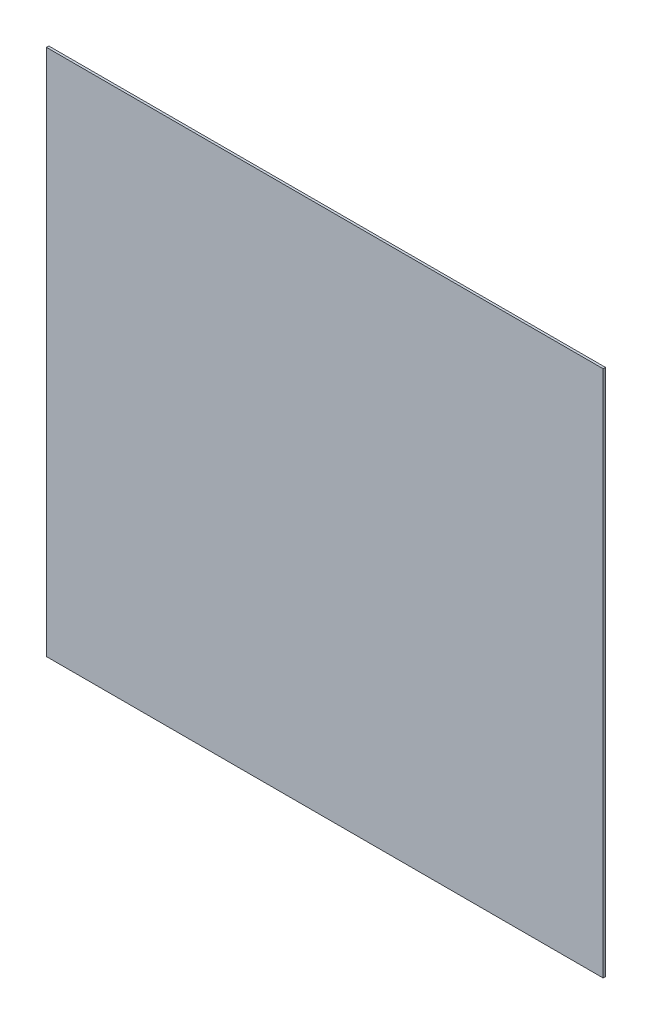
ISO-10303-21;
HEADER;
FILE_DESCRIPTION(('STEP AP214'),'2;1');
FILE_NAME('part.step','',(''),(''),'','','');
FILE_SCHEMA(('AUTOMOTIVE_DESIGN { 1 0 10303 214 1 1 1 1 }'));
ENDSEC;
DATA;
#1=APPLICATION_CONTEXT('core data for automotive mechanical design processes');
#2=APPLICATION_PROTOCOL_DEFINITION('international standard','automotive_design',2000,#1);
#3=PRODUCT_CONTEXT('',#1,'mechanical');
#4=PRODUCT('Part','Part','',(#3));
#5=PRODUCT_RELATED_PRODUCT_CATEGORY('part','',(#4));
#6=PRODUCT_DEFINITION_FORMATION('','',#4);
#7=PRODUCT_DEFINITION_CONTEXT('part definition',#1,'design');
#8=PRODUCT_DEFINITION('design','',#6,#7);
#9=PRODUCT_DEFINITION_SHAPE('','',#8);
#10=(LENGTH_UNIT() NAMED_UNIT(*) SI_UNIT(.MILLI.,.METRE.));
#11=(NAMED_UNIT(*) PLANE_ANGLE_UNIT() SI_UNIT($,.RADIAN.));
#12=(NAMED_UNIT(*) SI_UNIT($,.STERADIAN.) SOLID_ANGLE_UNIT());
#13=UNCERTAINTY_MEASURE_WITH_UNIT(LENGTH_MEASURE(1.E-05),#10,'distance_accuracy_value','');
#14=(GEOMETRIC_REPRESENTATION_CONTEXT(3) GLOBAL_UNCERTAINTY_ASSIGNED_CONTEXT((#13)) GLOBAL_UNIT_ASSIGNED_CONTEXT((#10,
#11,#12)) REPRESENTATION_CONTEXT('',''));
#15=CARTESIAN_POINT('',(0.,0.,0.));
#16=DIRECTION('',(0.,0.,1.));
#17=DIRECTION('',(1.,0.,0.));
#18=AXIS2_PLACEMENT_3D('',#15,#16,#17);
#19=CARTESIAN_POINT('',(560.475,-531.2625,4.7625));
#20=DIRECTION('',(-1.,0.,0.));
#21=DIRECTION('',(0.,0.,1.));
#22=AXIS2_PLACEMENT_3D('',#19,#20,#21);
#23=PLANE('',#22);
#24=DIRECTION('',(0.,1.,0.));
#25=VECTOR('',#24,1.);
#26=CARTESIAN_POINT('',(560.475,-531.2625,0.));
#27=LINE('',#26,#25);
#28=CARTESIAN_POINT('',(560.475,-531.2625,0.));
#29=VERTEX_POINT('',#28);
#30=CARTESIAN_POINT('',(560.475,531.2625,0.));
#31=VERTEX_POINT('',#30);
#32=EDGE_CURVE('E100',#29,#31,#27,.T.);
#33=ORIENTED_EDGE('',*,*,#32,.T.);
#34=DIRECTION('',(0.,0.,-1.));
#35=VECTOR('',#34,1.);
#36=CARTESIAN_POINT('',(560.475,531.2625,4.7625));
#37=LINE('',#36,#35);
#38=CARTESIAN_POINT('',(560.475,531.2625,4.7625));
#39=VERTEX_POINT('',#38);
#40=EDGE_CURVE('E11',#39,#31,#37,.T.);
#41=ORIENTED_EDGE('',*,*,#40,.F.);
#42=DIRECTION('',(0.,1.,0.));
#43=VECTOR('',#42,1.);
#44=CARTESIAN_POINT('',(560.475,-531.2625,4.7625));
#45=LINE('',#44,#43);
#46=CARTESIAN_POINT('',(560.475,-531.2625,4.7625));
#47=VERTEX_POINT('',#46);
#48=EDGE_CURVE('E88',#47,#39,#45,.T.);
#49=ORIENTED_EDGE('',*,*,#48,.F.);
#50=DIRECTION('',(0.,0.,-1.));
#51=VECTOR('',#50,1.);
#52=CARTESIAN_POINT('',(560.475,-531.2625,4.7625));
#53=LINE('',#52,#51);
#54=EDGE_CURVE('E96',#47,#29,#53,.T.);
#55=ORIENTED_EDGE('',*,*,#54,.T.);
#56=EDGE_LOOP('',(#33,#41,#49,#55));
#57=FACE_BOUND('',#56,.T.);
#58=ADVANCED_FACE('F37',(#57),#23,.F.);
#59=CARTESIAN_POINT('',(-560.475,531.2625,4.7625));
#60=DIRECTION('',(0.,-1.,0.));
#61=DIRECTION('',(0.,0.,-1.));
#62=AXIS2_PLACEMENT_3D('',#59,#60,#61);
#63=PLANE('',#62);
#64=DIRECTION('',(-1.,0.,0.));
#65=VECTOR('',#64,1.);
#66=CARTESIAN_POINT('',(-560.475,531.2625,0.));
#67=LINE('',#66,#65);
#68=CARTESIAN_POINT('',(-560.475,531.2625,0.));
#69=VERTEX_POINT('',#68);
#70=EDGE_CURVE('E92',#31,#69,#67,.T.);
#71=ORIENTED_EDGE('',*,*,#70,.T.);
#72=DIRECTION('',(0.,0.,-1.));
#73=VECTOR('',#72,1.);
#74=CARTESIAN_POINT('',(-560.475,531.2625,4.7625));
#75=LINE('',#74,#73);
#76=CARTESIAN_POINT('',(-560.475,531.2625,4.7625));
#77=VERTEX_POINT('',#76);
#78=EDGE_CURVE('E45',#77,#69,#75,.T.);
#79=ORIENTED_EDGE('',*,*,#78,.F.);
#80=DIRECTION('',(-1.,0.,0.));
#81=VECTOR('',#80,1.);
#82=CARTESIAN_POINT('',(-560.475,531.2625,4.7625));
#83=LINE('',#82,#81);
#84=EDGE_CURVE('E83',#39,#77,#83,.T.);
#85=ORIENTED_EDGE('',*,*,#84,.F.);
#86=ORIENTED_EDGE('',*,*,#40,.T.);
#87=EDGE_LOOP('',(#71,#79,#85,#86));
#88=FACE_BOUND('',#87,.T.);
#89=ADVANCED_FACE('F91',(#88),#63,.F.);
#90=CARTESIAN_POINT('',(-560.475,-531.2625,4.7625));
#91=DIRECTION('',(1.,0.,0.));
#92=DIRECTION('',(0.,0.,-1.));
#93=AXIS2_PLACEMENT_3D('',#90,#91,#92);
#94=PLANE('',#93);
#95=DIRECTION('',(0.,-1.,0.));
#96=VECTOR('',#95,1.);
#97=CARTESIAN_POINT('',(-560.475,-531.2625,0.));
#98=LINE('',#97,#96);
#99=CARTESIAN_POINT('',(-560.475,-531.2625,0.));
#100=VERTEX_POINT('',#99);
#101=EDGE_CURVE('E70',#69,#100,#98,.T.);
#102=ORIENTED_EDGE('',*,*,#101,.T.);
#103=DIRECTION('',(0.,0.,-1.));
#104=VECTOR('',#103,1.);
#105=CARTESIAN_POINT('',(-560.475,-531.2625,4.7625));
#106=LINE('',#105,#104);
#107=CARTESIAN_POINT('',(-560.475,-531.2625,4.7625));
#108=VERTEX_POINT('',#107);
#109=EDGE_CURVE('E93',#108,#100,#106,.T.);
#110=ORIENTED_EDGE('',*,*,#109,.F.);
#111=DIRECTION('',(0.,-1.,0.));
#112=VECTOR('',#111,1.);
#113=CARTESIAN_POINT('',(-560.475,-531.2625,4.7625));
#114=LINE('',#113,#112);
#115=EDGE_CURVE('E86',#77,#108,#114,.T.);
#116=ORIENTED_EDGE('',*,*,#115,.F.);
#117=ORIENTED_EDGE('',*,*,#78,.T.);
#118=EDGE_LOOP('',(#102,#110,#116,#117));
#119=FACE_BOUND('',#118,.T.);
#120=ADVANCED_FACE('F94',(#119),#94,.F.);
#121=CARTESIAN_POINT('',(-560.475,-531.2625,4.7625));
#122=DIRECTION('',(0.,1.,0.));
#123=DIRECTION('',(0.,0.,1.));
#124=AXIS2_PLACEMENT_3D('',#121,#122,#123);
#125=PLANE('',#124);
#126=DIRECTION('',(1.,0.,0.));
#127=VECTOR('',#126,1.);
#128=CARTESIAN_POINT('',(-560.475,-531.2625,0.));
#129=LINE('',#128,#127);
#130=EDGE_CURVE('E76',#100,#29,#129,.T.);
#131=ORIENTED_EDGE('',*,*,#130,.T.);
#132=ORIENTED_EDGE('',*,*,#54,.F.);
#133=DIRECTION('',(1.,0.,0.));
#134=VECTOR('',#133,1.);
#135=CARTESIAN_POINT('',(-560.475,-531.2625,4.7625));
#136=LINE('',#135,#134);
#137=EDGE_CURVE('E53',#108,#47,#136,.T.);
#138=ORIENTED_EDGE('',*,*,#137,.F.);
#139=ORIENTED_EDGE('',*,*,#109,.T.);
#140=EDGE_LOOP('',(#131,#132,#138,#139));
#141=FACE_BOUND('',#140,.T.);
#142=ADVANCED_FACE('F107',(#141),#125,.F.);
#143=CARTESIAN_POINT('',(0.,0.,4.7625));
#144=DIRECTION('',(0.,0.,-1.));
#145=DIRECTION('',(-1.,0.,0.));
#146=AXIS2_PLACEMENT_3D('',#143,#144,#145);
#147=PLANE('',#146);
#148=ORIENTED_EDGE('',*,*,#48,.T.);
#149=ORIENTED_EDGE('',*,*,#84,.T.);
#150=ORIENTED_EDGE('',*,*,#115,.T.);
#151=ORIENTED_EDGE('',*,*,#137,.T.);
#152=EDGE_LOOP('',(#148,#149,#150,#151));
#153=FACE_BOUND('',#152,.T.);
#154=ADVANCED_FACE('F84',(#153),#147,.F.);
#155=CARTESIAN_POINT('',(0.,0.,0.));
#156=DIRECTION('',(0.,0.,-1.));
#157=DIRECTION('',(-1.,0.,0.));
#158=AXIS2_PLACEMENT_3D('',#155,#156,#157);
#159=PLANE('',#158);
#160=ORIENTED_EDGE('',*,*,#32,.F.);
#161=ORIENTED_EDGE('',*,*,#130,.F.);
#162=ORIENTED_EDGE('',*,*,#101,.F.);
#163=ORIENTED_EDGE('',*,*,#70,.F.);
#164=EDGE_LOOP('',(#160,#161,#162,#163));
#165=FACE_BOUND('',#164,.T.);
#166=ADVANCED_FACE('F110',(#165),#159,.T.);
#167=CLOSED_SHELL('',(#58,#89,#120,#142,#154,#166));
#168=MANIFOLD_SOLID_BREP('B2',#167);
#169=ADVANCED_BREP_SHAPE_REPRESENTATION('',(#18,#168),#14);
#170=SHAPE_DEFINITION_REPRESENTATION(#9,#169);
ENDSEC;
END-ISO-10303-21;
